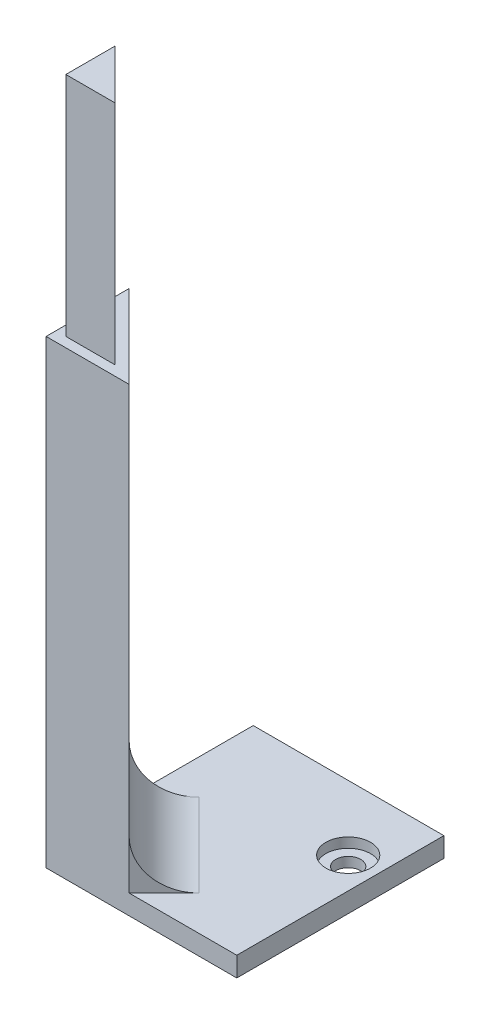
ISO-10303-21;
HEADER;
FILE_DESCRIPTION(('STEP AP214'),'2;1');
FILE_NAME('part.step','',(''),(''),'','','');
FILE_SCHEMA(('AUTOMOTIVE_DESIGN { 1 0 10303 214 1 1 1 1 }'));
ENDSEC;
DATA;
#1=APPLICATION_CONTEXT('core data for automotive mechanical design processes');
#2=APPLICATION_PROTOCOL_DEFINITION('international standard','automotive_design',2000,#1);
#3=PRODUCT_CONTEXT('',#1,'mechanical');
#4=PRODUCT('Part','Part','',(#3));
#5=PRODUCT_RELATED_PRODUCT_CATEGORY('part','',(#4));
#6=PRODUCT_DEFINITION_FORMATION('','',#4);
#7=PRODUCT_DEFINITION_CONTEXT('part definition',#1,'design');
#8=PRODUCT_DEFINITION('design','',#6,#7);
#9=PRODUCT_DEFINITION_SHAPE('','',#8);
#10=(LENGTH_UNIT() NAMED_UNIT(*) SI_UNIT(.MILLI.,.METRE.));
#11=(NAMED_UNIT(*) PLANE_ANGLE_UNIT() SI_UNIT($,.RADIAN.));
#12=(NAMED_UNIT(*) SI_UNIT($,.STERADIAN.) SOLID_ANGLE_UNIT());
#13=UNCERTAINTY_MEASURE_WITH_UNIT(LENGTH_MEASURE(1.E-05),#10,'distance_accuracy_value','');
#14=(GEOMETRIC_REPRESENTATION_CONTEXT(3) GLOBAL_UNCERTAINTY_ASSIGNED_CONTEXT((#13)) GLOBAL_UNIT_ASSIGNED_CONTEXT((#10,
#11,#12)) REPRESENTATION_CONTEXT('',''));
#15=CARTESIAN_POINT('',(0.,0.,0.));
#16=DIRECTION('',(0.,0.,1.));
#17=DIRECTION('',(1.,0.,0.));
#18=AXIS2_PLACEMENT_3D('',#15,#16,#17);
#19=CARTESIAN_POINT('',(45.59,6.,-40.3));
#20=DIRECTION('',(0.,-1.,0.));
#21=DIRECTION('',(0.,0.,-1.));
#22=AXIS2_PLACEMENT_3D('',#19,#20,#21);
#23=CYLINDRICAL_SURFACE('',#22,3.8);
#24=CARTESIAN_POINT('',(45.59,0.,-40.3));
#25=DIRECTION('',(0.,-1.,0.));
#26=DIRECTION('',(0.,0.,-1.));
#27=AXIS2_PLACEMENT_3D('',#24,#25,#26);
#28=CIRCLE('',#27,3.8);
#29=CARTESIAN_POINT('',(45.59,0.,-44.1));
#30=VERTEX_POINT('',#29);
#31=EDGE_CURVE('E158',#30,#30,#28,.T.);
#32=ORIENTED_EDGE('',*,*,#31,.T.);
#33=EDGE_LOOP('',(#32));
#34=FACE_BOUND('',#33,.T.);
#35=CARTESIAN_POINT('',(45.59,3.,-40.3));
#36=DIRECTION('',(0.,1.,0.));
#37=DIRECTION('',(0.,0.,1.));
#38=AXIS2_PLACEMENT_3D('',#35,#36,#37);
#39=CIRCLE('',#38,3.8);
#40=CARTESIAN_POINT('',(45.59,3.,-36.5));
#41=VERTEX_POINT('',#40);
#42=EDGE_CURVE('E44',#41,#41,#39,.F.);
#43=ORIENTED_EDGE('',*,*,#42,.F.);
#44=EDGE_LOOP('',(#43));
#45=FACE_BOUND('',#44,.T.);
#46=ADVANCED_FACE('F40',(#34,#45),#23,.F.);
#47=CARTESIAN_POINT('',(22.2426406871193,140.,3.));
#48=DIRECTION('',(0.707106781186547,0.,-0.707106781186547));
#49=DIRECTION('',(-0.707106781186548,0.,-0.707106781186548));
#50=AXIS2_PLACEMENT_3D('',#47,#48,#49);
#51=PLANE('',#50);
#52=DIRECTION('',(0.,-1.,0.));
#53=VECTOR('',#52,1.);
#54=CARTESIAN_POINT('',(22.2426406871193,140.,3.));
#55=LINE('',#54,#53);
#56=CARTESIAN_POINT('',(22.2426406871193,140.,3.));
#57=VERTEX_POINT('',#56);
#58=CARTESIAN_POINT('',(22.2426406871193,21.,3.));
#59=VERTEX_POINT('',#58);
#60=EDGE_CURVE('E207',#57,#59,#55,.T.);
#61=ORIENTED_EDGE('',*,*,#60,.T.);
#62=DIRECTION('',(0.707106781186547,0.,0.707106781186547));
#63=VECTOR('',#62,1.);
#64=CARTESIAN_POINT('',(-3.,21.,-22.2426406871193));
#65=LINE('',#64,#63);
#66=CARTESIAN_POINT('',(-3.,21.,-22.2426406871193));
#67=VERTEX_POINT('',#66);
#68=EDGE_CURVE('E126',#67,#59,#65,.T.);
#69=ORIENTED_EDGE('',*,*,#68,.F.);
#70=DIRECTION('',(0.,-1.,0.));
#71=VECTOR('',#70,1.);
#72=CARTESIAN_POINT('',(-3.,140.,-22.2426406871193));
#73=LINE('',#72,#71);
#74=CARTESIAN_POINT('',(-3.,140.,-22.2426406871193));
#75=VERTEX_POINT('',#74);
#76=EDGE_CURVE('E213',#75,#67,#73,.T.);
#77=ORIENTED_EDGE('',*,*,#76,.F.);
#78=DIRECTION('',(0.707106781186547,0.,0.707106781186547));
#79=VECTOR('',#78,1.);
#80=CARTESIAN_POINT('',(22.2426406871193,140.,3.));
#81=LINE('',#80,#79);
#82=EDGE_CURVE('E194',#75,#57,#81,.T.);
#83=ORIENTED_EDGE('',*,*,#82,.T.);
#84=EDGE_LOOP('',(#61,#69,#77,#83));
#85=FACE_BOUND('',#84,.T.);
#86=ADVANCED_FACE('F277',(#85),#51,.T.);
#87=CARTESIAN_POINT('',(0.,6.,0.));
#88=DIRECTION('',(0.,-1.,0.));
#89=DIRECTION('',(0.,0.,-1.));
#90=AXIS2_PLACEMENT_3D('',#87,#88,#89);
#91=PLANE('',#90);
#92=CARTESIAN_POINT('',(45.59,6.,-40.3));
#93=DIRECTION('',(0.,1.,0.));
#94=DIRECTION('',(0.,0.,1.));
#95=AXIS2_PLACEMENT_3D('',#92,#93,#94);
#96=CIRCLE('',#95,6.8);
#97=CARTESIAN_POINT('',(45.59,6.,-33.5));
#98=VERTEX_POINT('',#97);
#99=EDGE_CURVE('E325',#98,#98,#96,.T.);
#100=ORIENTED_EDGE('',*,*,#99,.F.);
#101=EDGE_LOOP('',(#100));
#102=FACE_BOUND('',#101,.T.);
#103=DIRECTION('',(0.,0.,1.));
#104=VECTOR('',#103,1.);
#105=CARTESIAN_POINT('',(-3.,6.,0.));
#106=LINE('',#105,#104);
#107=CARTESIAN_POINT('',(-3.,6.,-60.));
#108=VERTEX_POINT('',#107);
#109=CARTESIAN_POINT('',(-3.,6.,-22.2426406871193));
#110=VERTEX_POINT('',#109);
#111=EDGE_CURVE('E159',#108,#110,#106,.T.);
#112=ORIENTED_EDGE('',*,*,#111,.T.);
#113=DIRECTION('',(-0.707106781186547,0.,0.707106781186548));
#114=VECTOR('',#113,1.);
#115=CARTESIAN_POINT('',(-3.,6.,-22.2426406871193));
#116=LINE('',#115,#114);
#117=CARTESIAN_POINT('',(7.60660171779821,6.,-32.8492424049175));
#118=VERTEX_POINT('',#117);
#119=EDGE_CURVE('E139',#118,#110,#116,.T.);
#120=ORIENTED_EDGE('',*,*,#119,.F.);
#121=DIRECTION('',(-0.707106781186547,0.,-0.707106781186547));
#122=VECTOR('',#121,1.);
#123=CARTESIAN_POINT('',(7.60660171779821,6.,-32.8492424049175));
#124=LINE('',#123,#122);
#125=CARTESIAN_POINT('',(32.8492424049175,6.,-7.60660171779821));
#126=VERTEX_POINT('',#125);
#127=EDGE_CURVE('E125',#126,#118,#124,.T.);
#128=ORIENTED_EDGE('',*,*,#127,.F.);
#129=DIRECTION('',(0.707106781186548,0.,-0.707106781186547));
#130=VECTOR('',#129,1.);
#131=CARTESIAN_POINT('',(32.8492424049175,6.,-7.60660171779821));
#132=LINE('',#131,#130);
#133=CARTESIAN_POINT('',(22.2426406871193,6.,3.));
#134=VERTEX_POINT('',#133);
#135=EDGE_CURVE('E136',#134,#126,#132,.T.);
#136=ORIENTED_EDGE('',*,*,#135,.F.);
#137=DIRECTION('',(1.,0.,0.));
#138=VECTOR('',#137,1.);
#139=CARTESIAN_POINT('',(0.,6.,3.));
#140=LINE('',#139,#138);
#141=CARTESIAN_POINT('',(55.,6.,3.));
#142=VERTEX_POINT('',#141);
#143=EDGE_CURVE('E169',#134,#142,#140,.T.);
#144=ORIENTED_EDGE('',*,*,#143,.T.);
#145=DIRECTION('',(0.,0.,-1.));
#146=VECTOR('',#145,1.);
#147=CARTESIAN_POINT('',(55.,6.,0.));
#148=LINE('',#147,#146);
#149=CARTESIAN_POINT('',(55.,6.,-60.));
#150=VERTEX_POINT('',#149);
#151=EDGE_CURVE('E166',#142,#150,#148,.T.);
#152=ORIENTED_EDGE('',*,*,#151,.T.);
#153=DIRECTION('',(-1.,0.,0.));
#154=VECTOR('',#153,1.);
#155=CARTESIAN_POINT('',(0.,6.,-60.));
#156=LINE('',#155,#154);
#157=EDGE_CURVE('E162',#150,#108,#156,.T.);
#158=ORIENTED_EDGE('',*,*,#157,.T.);
#159=EDGE_LOOP('',(#112,#120,#128,#136,#144,#152,#158));
#160=FACE_BOUND('',#159,.T.);
#161=ADVANCED_FACE('F135',(#102,#160),#91,.F.);
#162=CARTESIAN_POINT('',(0.,320.,0.));
#163=DIRECTION('',(0.,0.,-1.));
#164=DIRECTION('',(-1.,0.,0.));
#165=AXIS2_PLACEMENT_3D('',#162,#163,#164);
#166=PLANE('',#165);
#167=DIRECTION('',(0.,-1.,0.));
#168=VECTOR('',#167,1.);
#169=CARTESIAN_POINT('',(0.,320.,0.));
#170=LINE('',#169,#168);
#171=CARTESIAN_POINT('',(0.,209.,0.));
#172=VERTEX_POINT('',#171);
#173=CARTESIAN_POINT('',(0.,140.,0.));
#174=VERTEX_POINT('',#173);
#175=EDGE_CURVE('E239',#172,#174,#170,.T.);
#176=ORIENTED_EDGE('',*,*,#175,.T.);
#177=DIRECTION('',(1.,0.,0.));
#178=VECTOR('',#177,1.);
#179=CARTESIAN_POINT('',(0.,140.,0.));
#180=LINE('',#179,#178);
#181=CARTESIAN_POINT('',(15.,140.,0.));
#182=VERTEX_POINT('',#181);
#183=EDGE_CURVE('E65',#174,#182,#180,.T.);
#184=ORIENTED_EDGE('',*,*,#183,.T.);
#185=DIRECTION('',(0.,-1.,0.));
#186=VECTOR('',#185,1.);
#187=CARTESIAN_POINT('',(15.,320.,0.));
#188=LINE('',#187,#186);
#189=CARTESIAN_POINT('',(15.,209.,0.));
#190=VERTEX_POINT('',#189);
#191=EDGE_CURVE('E50',#190,#182,#188,.T.);
#192=ORIENTED_EDGE('',*,*,#191,.F.);
#193=DIRECTION('',(1.,0.,0.));
#194=VECTOR('',#193,1.);
#195=CARTESIAN_POINT('',(0.,209.,0.));
#196=LINE('',#195,#194);
#197=EDGE_CURVE('E229',#172,#190,#196,.T.);
#198=ORIENTED_EDGE('',*,*,#197,.F.);
#199=EDGE_LOOP('',(#176,#184,#192,#198));
#200=FACE_BOUND('',#199,.T.);
#201=ADVANCED_FACE('F42',(#200),#166,.F.);
#202=CARTESIAN_POINT('',(0.,320.,-15.));
#203=DIRECTION('',(-0.707106781186548,0.,0.707106781186548));
#204=DIRECTION('',(0.707106781186548,0.,0.707106781186548));
#205=AXIS2_PLACEMENT_3D('',#202,#203,#204);
#206=PLANE('',#205);
#207=ORIENTED_EDGE('',*,*,#191,.T.);
#208=DIRECTION('',(-0.707106781186548,0.,-0.707106781186548));
#209=VECTOR('',#208,1.);
#210=CARTESIAN_POINT('',(0.,140.,-15.));
#211=LINE('',#210,#209);
#212=CARTESIAN_POINT('',(0.,140.,-15.));
#213=VERTEX_POINT('',#212);
#214=EDGE_CURVE('E217',#182,#213,#211,.T.);
#215=ORIENTED_EDGE('',*,*,#214,.T.);
#216=DIRECTION('',(0.,-1.,0.));
#217=VECTOR('',#216,1.);
#218=CARTESIAN_POINT('',(0.,320.,-15.));
#219=LINE('',#218,#217);
#220=CARTESIAN_POINT('',(0.,209.,-15.));
#221=VERTEX_POINT('',#220);
#222=EDGE_CURVE('E243',#221,#213,#219,.T.);
#223=ORIENTED_EDGE('',*,*,#222,.F.);
#224=DIRECTION('',(0.707106781186548,0.,0.707106781186548));
#225=VECTOR('',#224,1.);
#226=CARTESIAN_POINT('',(0.,209.,-15.));
#227=LINE('',#226,#225);
#228=EDGE_CURVE('E235',#221,#190,#227,.T.);
#229=ORIENTED_EDGE('',*,*,#228,.T.);
#230=EDGE_LOOP('',(#207,#215,#223,#229));
#231=FACE_BOUND('',#230,.T.);
#232=ADVANCED_FACE('F251',(#231),#206,.F.);
#233=CARTESIAN_POINT('',(0.,320.,0.));
#234=DIRECTION('',(1.,0.,0.));
#235=DIRECTION('',(0.,0.,-1.));
#236=AXIS2_PLACEMENT_3D('',#233,#234,#235);
#237=PLANE('',#236);
#238=ORIENTED_EDGE('',*,*,#222,.T.);
#239=DIRECTION('',(0.,0.,1.));
#240=VECTOR('',#239,1.);
#241=CARTESIAN_POINT('',(0.,140.,0.));
#242=LINE('',#241,#240);
#243=EDGE_CURVE('E11',#213,#174,#242,.T.);
#244=ORIENTED_EDGE('',*,*,#243,.T.);
#245=ORIENTED_EDGE('',*,*,#175,.F.);
#246=DIRECTION('',(0.,0.,1.));
#247=VECTOR('',#246,1.);
#248=CARTESIAN_POINT('',(0.,209.,-15.));
#249=LINE('',#248,#247);
#250=EDGE_CURVE('E232',#221,#172,#249,.T.);
#251=ORIENTED_EDGE('',*,*,#250,.F.);
#252=EDGE_LOOP('',(#238,#244,#245,#251));
#253=FACE_BOUND('',#252,.T.);
#254=ADVANCED_FACE('F258',(#253),#237,.F.);
#255=CARTESIAN_POINT('',(0.,209.,-15.));
#256=DIRECTION('',(0.,-1.,0.));
#257=DIRECTION('',(0.,0.,-1.));
#258=AXIS2_PLACEMENT_3D('',#255,#256,#257);
#259=PLANE('',#258);
#260=ORIENTED_EDGE('',*,*,#250,.T.);
#261=ORIENTED_EDGE('',*,*,#197,.T.);
#262=ORIENTED_EDGE('',*,*,#228,.F.);
#263=EDGE_LOOP('',(#260,#261,#262));
#264=FACE_BOUND('',#263,.T.);
#265=ADVANCED_FACE('F262',(#264),#259,.F.);
#266=CARTESIAN_POINT('',(0.,140.,0.));
#267=DIRECTION('',(0.,1.,0.));
#268=DIRECTION('',(0.,0.,1.));
#269=AXIS2_PLACEMENT_3D('',#266,#267,#268);
#270=PLANE('',#269);
#271=ORIENTED_EDGE('',*,*,#82,.F.);
#272=DIRECTION('',(0.,0.,-1.));
#273=VECTOR('',#272,1.);
#274=CARTESIAN_POINT('',(-3.,140.,-22.2426406871193));
#275=LINE('',#274,#273);
#276=CARTESIAN_POINT('',(-3.,140.,3.));
#277=VERTEX_POINT('',#276);
#278=EDGE_CURVE('E203',#277,#75,#275,.T.);
#279=ORIENTED_EDGE('',*,*,#278,.F.);
#280=DIRECTION('',(-1.,0.,0.));
#281=VECTOR('',#280,1.);
#282=CARTESIAN_POINT('',(-3.,140.,3.));
#283=LINE('',#282,#281);
#284=EDGE_CURVE('E198',#57,#277,#283,.T.);
#285=ORIENTED_EDGE('',*,*,#284,.F.);
#286=EDGE_LOOP('',(#271,#279,#285));
#287=FACE_BOUND('',#286,.T.);
#288=ORIENTED_EDGE('',*,*,#183,.F.);
#289=ORIENTED_EDGE('',*,*,#243,.F.);
#290=ORIENTED_EDGE('',*,*,#214,.F.);
#291=EDGE_LOOP('',(#288,#289,#290));
#292=FACE_BOUND('',#291,.T.);
#293=ADVANCED_FACE('F259',(#287,#292),#270,.T.);
#294=CARTESIAN_POINT('',(-3.,140.,-22.2426406871193));
#295=DIRECTION('',(-1.,0.,0.));
#296=DIRECTION('',(0.,0.,1.));
#297=AXIS2_PLACEMENT_3D('',#294,#295,#296);
#298=PLANE('',#297);
#299=DIRECTION('',(0.,0.,-1.));
#300=VECTOR('',#299,1.);
#301=CARTESIAN_POINT('',(-3.,0.,-22.2426406871193));
#302=LINE('',#301,#300);
#303=CARTESIAN_POINT('',(-3.,0.,3.));
#304=VERTEX_POINT('',#303);
#305=CARTESIAN_POINT('',(-3.,0.,-60.));
#306=VERTEX_POINT('',#305);
#307=EDGE_CURVE('E199',#304,#306,#302,.T.);
#308=ORIENTED_EDGE('',*,*,#307,.F.);
#309=DIRECTION('',(0.,-1.,0.));
#310=VECTOR('',#309,1.);
#311=CARTESIAN_POINT('',(-3.,140.,3.));
#312=LINE('',#311,#310);
#313=EDGE_CURVE('E218',#277,#304,#312,.T.);
#314=ORIENTED_EDGE('',*,*,#313,.F.);
#315=ORIENTED_EDGE('',*,*,#278,.T.);
#316=ORIENTED_EDGE('',*,*,#76,.T.);
#317=DIRECTION('',(0.,-1.,0.));
#318=VECTOR('',#317,1.);
#319=CARTESIAN_POINT('',(-3.,21.,-22.2426406871193));
#320=LINE('',#319,#318);
#321=EDGE_CURVE('E152',#67,#110,#320,.T.);
#322=ORIENTED_EDGE('',*,*,#321,.T.);
#323=ORIENTED_EDGE('',*,*,#111,.F.);
#324=DIRECTION('',(0.,-1.,0.));
#325=VECTOR('',#324,1.);
#326=CARTESIAN_POINT('',(-3.,6.,-60.));
#327=LINE('',#326,#325);
#328=EDGE_CURVE('E172',#108,#306,#327,.T.);
#329=ORIENTED_EDGE('',*,*,#328,.T.);
#330=EDGE_LOOP('',(#308,#314,#315,#316,#322,#323,#329));
#331=FACE_BOUND('',#330,.T.);
#332=ADVANCED_FACE('F261',(#331),#298,.T.);
#333=CARTESIAN_POINT('',(-3.,140.,3.));
#334=DIRECTION('',(0.,0.,1.));
#335=DIRECTION('',(1.,0.,0.));
#336=AXIS2_PLACEMENT_3D('',#333,#334,#335);
#337=PLANE('',#336);
#338=DIRECTION('',(-1.,0.,0.));
#339=VECTOR('',#338,1.);
#340=CARTESIAN_POINT('',(-3.,0.,3.));
#341=LINE('',#340,#339);
#342=CARTESIAN_POINT('',(55.,0.,3.));
#343=VERTEX_POINT('',#342);
#344=EDGE_CURVE('E186',#343,#304,#341,.T.);
#345=ORIENTED_EDGE('',*,*,#344,.F.);
#346=DIRECTION('',(0.,-1.,0.));
#347=VECTOR('',#346,1.);
#348=CARTESIAN_POINT('',(55.,6.,3.));
#349=LINE('',#348,#347);
#350=EDGE_CURVE('E182',#142,#343,#349,.T.);
#351=ORIENTED_EDGE('',*,*,#350,.F.);
#352=ORIENTED_EDGE('',*,*,#143,.F.);
#353=DIRECTION('',(0.,-1.,0.));
#354=VECTOR('',#353,1.);
#355=CARTESIAN_POINT('',(22.2426406871193,21.,3.));
#356=LINE('',#355,#354);
#357=EDGE_CURVE('E143',#59,#134,#356,.T.);
#358=ORIENTED_EDGE('',*,*,#357,.F.);
#359=ORIENTED_EDGE('',*,*,#60,.F.);
#360=ORIENTED_EDGE('',*,*,#284,.T.);
#361=ORIENTED_EDGE('',*,*,#313,.T.);
#362=EDGE_LOOP('',(#345,#351,#352,#358,#359,#360,#361));
#363=FACE_BOUND('',#362,.T.);
#364=ADVANCED_FACE('F269',(#363),#337,.T.);
#365=CARTESIAN_POINT('',(0.,0.,0.));
#366=DIRECTION('',(0.,1.,0.));
#367=DIRECTION('',(0.,0.,1.));
#368=AXIS2_PLACEMENT_3D('',#365,#366,#367);
#369=PLANE('',#368);
#370=ORIENTED_EDGE('',*,*,#307,.T.);
#371=DIRECTION('',(-1.,0.,0.));
#372=VECTOR('',#371,1.);
#373=CARTESIAN_POINT('',(0.,0.,-60.));
#374=LINE('',#373,#372);
#375=CARTESIAN_POINT('',(55.,0.,-60.));
#376=VERTEX_POINT('',#375);
#377=EDGE_CURVE('E176',#376,#306,#374,.T.);
#378=ORIENTED_EDGE('',*,*,#377,.F.);
#379=DIRECTION('',(0.,0.,-1.));
#380=VECTOR('',#379,1.);
#381=CARTESIAN_POINT('',(55.,0.,0.));
#382=LINE('',#381,#380);
#383=EDGE_CURVE('E163',#343,#376,#382,.T.);
#384=ORIENTED_EDGE('',*,*,#383,.F.);
#385=ORIENTED_EDGE('',*,*,#344,.T.);
#386=EDGE_LOOP('',(#370,#378,#384,#385));
#387=FACE_BOUND('',#386,.T.);
#388=ORIENTED_EDGE('',*,*,#31,.F.);
#389=EDGE_LOOP('',(#388));
#390=FACE_BOUND('',#389,.T.);
#391=ADVANCED_FACE('F295',(#387,#390),#369,.F.);
#392=CARTESIAN_POINT('',(55.,6.,0.));
#393=DIRECTION('',(-1.,0.,0.));
#394=DIRECTION('',(0.,0.,1.));
#395=AXIS2_PLACEMENT_3D('',#392,#393,#394);
#396=PLANE('',#395);
#397=ORIENTED_EDGE('',*,*,#383,.T.);
#398=DIRECTION('',(0.,-1.,0.));
#399=VECTOR('',#398,1.);
#400=CARTESIAN_POINT('',(55.,6.,-60.));
#401=LINE('',#400,#399);
#402=EDGE_CURVE('E187',#150,#376,#401,.T.);
#403=ORIENTED_EDGE('',*,*,#402,.F.);
#404=ORIENTED_EDGE('',*,*,#151,.F.);
#405=ORIENTED_EDGE('',*,*,#350,.T.);
#406=EDGE_LOOP('',(#397,#403,#404,#405));
#407=FACE_BOUND('',#406,.T.);
#408=ADVANCED_FACE('F291',(#407),#396,.F.);
#409=CARTESIAN_POINT('',(0.,6.,-60.));
#410=DIRECTION('',(0.,0.,1.));
#411=DIRECTION('',(1.,0.,0.));
#412=AXIS2_PLACEMENT_3D('',#409,#410,#411);
#413=PLANE('',#412);
#414=ORIENTED_EDGE('',*,*,#377,.T.);
#415=ORIENTED_EDGE('',*,*,#328,.F.);
#416=ORIENTED_EDGE('',*,*,#157,.F.);
#417=ORIENTED_EDGE('',*,*,#402,.T.);
#418=EDGE_LOOP('',(#414,#415,#416,#417));
#419=FACE_BOUND('',#418,.T.);
#420=ADVANCED_FACE('F288',(#419),#413,.F.);
#421=CARTESIAN_POINT('',(32.8492424049175,21.,-7.60660171779821));
#422=DIRECTION('',(-0.707106781186547,0.,-0.707106781186548));
#423=DIRECTION('',(-0.707106781186548,0.,0.707106781186547));
#424=AXIS2_PLACEMENT_3D('',#421,#422,#423);
#425=PLANE('',#424);
#426=ORIENTED_EDGE('',*,*,#135,.T.);
#427=CARTESIAN_POINT('',(32.8492424049175,21.,-7.6066017177982));
#428=DIRECTION('',(0.707106781186547,0.,0.707106781186548));
#429=DIRECTION('',(0.707106781186548,0.,-0.707106781186547));
#430=AXIS2_PLACEMENT_3D('',#427,#428,#429);
#431=CIRCLE('',#430,15.);
#432=EDGE_CURVE('E122',#59,#126,#431,.T.);
#433=ORIENTED_EDGE('',*,*,#432,.F.);
#434=ORIENTED_EDGE('',*,*,#357,.T.);
#435=EDGE_LOOP('',(#426,#433,#434));
#436=FACE_BOUND('',#435,.T.);
#437=ADVANCED_FACE('F142',(#436),#425,.F.);
#438=CARTESIAN_POINT('',(-3.,21.,-22.2426406871193));
#439=DIRECTION('',(0.707106781186548,0.,0.707106781186547));
#440=DIRECTION('',(0.707106781186547,0.,-0.707106781186548));
#441=AXIS2_PLACEMENT_3D('',#438,#439,#440);
#442=PLANE('',#441);
#443=ORIENTED_EDGE('',*,*,#321,.F.);
#444=CARTESIAN_POINT('',(7.60660171779821,21.,-32.8492424049175));
#445=DIRECTION('',(0.707106781186548,0.,0.707106781186547));
#446=DIRECTION('',(0.707106781186547,0.,-0.707106781186548));
#447=AXIS2_PLACEMENT_3D('',#444,#445,#446);
#448=CIRCLE('',#447,15.);
#449=EDGE_CURVE('E57',#67,#118,#448,.T.);
#450=ORIENTED_EDGE('',*,*,#449,.T.);
#451=ORIENTED_EDGE('',*,*,#119,.T.);
#452=EDGE_LOOP('',(#443,#450,#451));
#453=FACE_BOUND('',#452,.T.);
#454=ADVANCED_FACE('F301',(#453),#442,.F.);
#455=CARTESIAN_POINT('',(-11.2720779386422,21.,-51.7279220613579));
#456=DIRECTION('',(0.707106781186547,0.,0.707106781186548));
#457=DIRECTION('',(0.707106781186548,0.,-0.707106781186547));
#458=AXIS2_PLACEMENT_3D('',#455,#456,#457);
#459=CYLINDRICAL_SURFACE('',#458,15.);
#460=ORIENTED_EDGE('',*,*,#68,.T.);
#461=ORIENTED_EDGE('',*,*,#432,.T.);
#462=ORIENTED_EDGE('',*,*,#127,.T.);
#463=ORIENTED_EDGE('',*,*,#449,.F.);
#464=EDGE_LOOP('',(#460,#461,#462,#463));
#465=FACE_BOUND('',#464,.T.);
#466=ADVANCED_FACE('F124',(#465),#459,.F.);
#467=CARTESIAN_POINT('',(45.59,3.,-40.3));
#468=DIRECTION('',(0.,1.,0.));
#469=DIRECTION('',(0.,0.,1.));
#470=AXIS2_PLACEMENT_3D('',#467,#468,#469);
#471=PLANE('',#470);
#472=CARTESIAN_POINT('',(45.59,3.,-40.3));
#473=DIRECTION('',(0.,1.,0.));
#474=DIRECTION('',(0.,0.,1.));
#475=AXIS2_PLACEMENT_3D('',#472,#473,#474);
#476=CIRCLE('',#475,6.8);
#477=CARTESIAN_POINT('',(45.59,3.,-33.5));
#478=VERTEX_POINT('',#477);
#479=EDGE_CURVE('E320',#478,#478,#476,.T.);
#480=ORIENTED_EDGE('',*,*,#479,.T.);
#481=EDGE_LOOP('',(#480));
#482=FACE_BOUND('',#481,.T.);
#483=ORIENTED_EDGE('',*,*,#42,.T.);
#484=EDGE_LOOP('',(#483));
#485=FACE_BOUND('',#484,.T.);
#486=ADVANCED_FACE('F307',(#482,#485),#471,.T.);
#487=CARTESIAN_POINT('',(45.59,3.,-40.3));
#488=DIRECTION('',(0.,1.,0.));
#489=DIRECTION('',(0.,0.,1.));
#490=AXIS2_PLACEMENT_3D('',#487,#488,#489);
#491=CYLINDRICAL_SURFACE('',#490,6.8);
#492=ORIENTED_EDGE('',*,*,#479,.F.);
#493=EDGE_LOOP('',(#492));
#494=FACE_BOUND('',#493,.T.);
#495=ORIENTED_EDGE('',*,*,#99,.T.);
#496=EDGE_LOOP('',(#495));
#497=FACE_BOUND('',#496,.T.);
#498=ADVANCED_FACE('F308',(#494,#497),#491,.F.);
#499=CLOSED_SHELL('',(#46,#86,#161,#201,#232,#254,#265,#293,#332,#364,#391,#408,#420,#437,#454,
#466,#486,#498));
#500=MANIFOLD_SOLID_BREP('B2',#499);
#501=ADVANCED_BREP_SHAPE_REPRESENTATION('',(#18,#500),#14);
#502=SHAPE_DEFINITION_REPRESENTATION(#9,#501);
ENDSEC;
END-ISO-10303-21;
